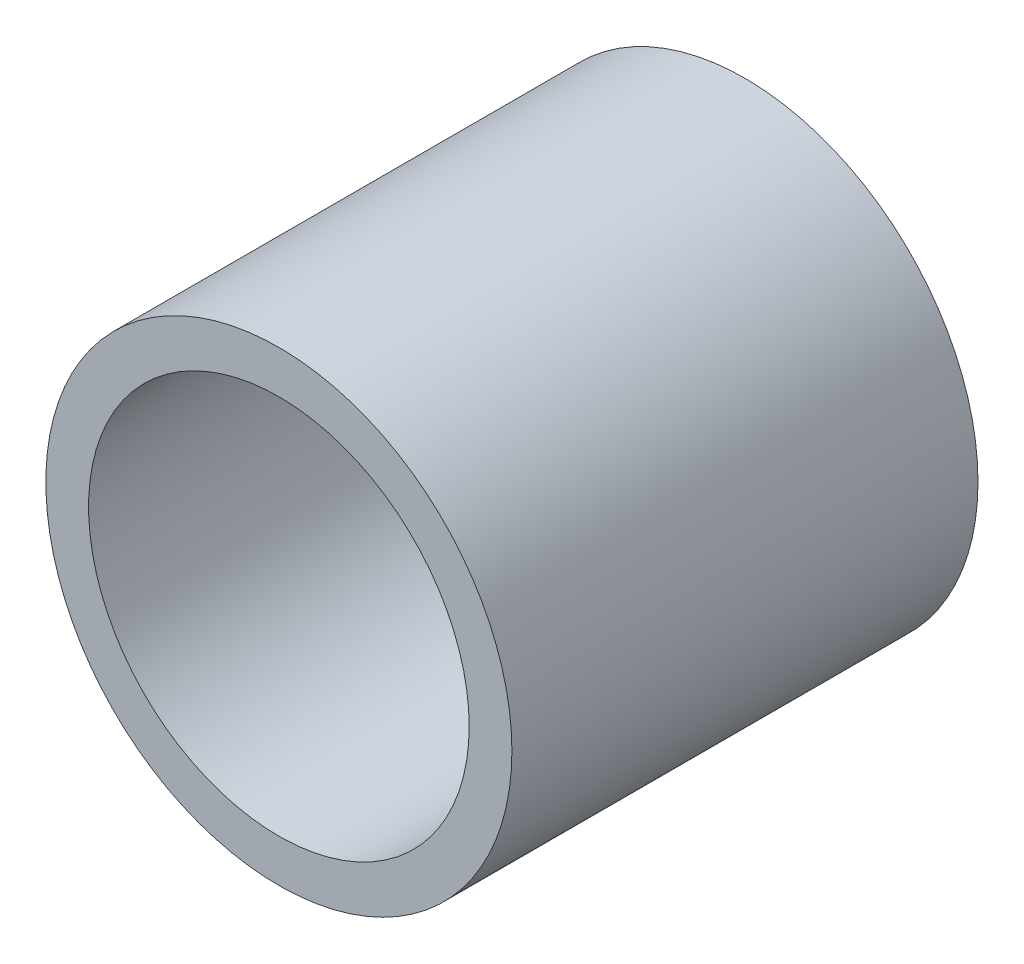
ISO-10303-21;
HEADER;
FILE_DESCRIPTION(('STEP AP214'),'2;1');
FILE_NAME('part.step','',(''),(''),'','','');
FILE_SCHEMA(('AUTOMOTIVE_DESIGN { 1 0 10303 214 1 1 1 1 }'));
ENDSEC;
DATA;
#1=APPLICATION_CONTEXT('core data for automotive mechanical design processes');
#2=APPLICATION_PROTOCOL_DEFINITION('international standard','automotive_design',2000,#1);
#3=PRODUCT_CONTEXT('',#1,'mechanical');
#4=PRODUCT('Part','Part','',(#3));
#5=PRODUCT_RELATED_PRODUCT_CATEGORY('part','',(#4));
#6=PRODUCT_DEFINITION_FORMATION('','',#4);
#7=PRODUCT_DEFINITION_CONTEXT('part definition',#1,'design');
#8=PRODUCT_DEFINITION('design','',#6,#7);
#9=PRODUCT_DEFINITION_SHAPE('','',#8);
#10=(LENGTH_UNIT() NAMED_UNIT(*) SI_UNIT(.MILLI.,.METRE.));
#11=(NAMED_UNIT(*) PLANE_ANGLE_UNIT() SI_UNIT($,.RADIAN.));
#12=(NAMED_UNIT(*) SI_UNIT($,.STERADIAN.) SOLID_ANGLE_UNIT());
#13=UNCERTAINTY_MEASURE_WITH_UNIT(LENGTH_MEASURE(1.E-05),#10,'distance_accuracy_value','');
#14=(GEOMETRIC_REPRESENTATION_CONTEXT(3) GLOBAL_UNCERTAINTY_ASSIGNED_CONTEXT((#13)) GLOBAL_UNIT_ASSIGNED_CONTEXT((#10,
#11,#12)) REPRESENTATION_CONTEXT('',''));
#15=CARTESIAN_POINT('',(0.,0.,0.));
#16=DIRECTION('',(0.,0.,1.));
#17=DIRECTION('',(1.,0.,0.));
#18=AXIS2_PLACEMENT_3D('',#15,#16,#17);
#19=CARTESIAN_POINT('',(0.,0.,120.));
#20=DIRECTION('',(0.,0.,-1.));
#21=DIRECTION('',(-1.,0.,0.));
#22=AXIS2_PLACEMENT_3D('',#19,#20,#21);
#23=CYLINDRICAL_SURFACE('',#22,60.);
#24=CARTESIAN_POINT('',(0.,0.,120.));
#25=DIRECTION('',(0.,0.,1.));
#26=DIRECTION('',(1.,0.,0.));
#27=AXIS2_PLACEMENT_3D('',#24,#25,#26);
#28=CIRCLE('',#27,60.);
#29=CARTESIAN_POINT('',(60.,0.,120.));
#30=VERTEX_POINT('',#29);
#31=EDGE_CURVE('E10',#30,#30,#28,.T.);
#32=ORIENTED_EDGE('',*,*,#31,.F.);
#33=EDGE_LOOP('',(#32));
#34=FACE_BOUND('',#33,.T.);
#35=CARTESIAN_POINT('',(0.,0.,0.));
#36=DIRECTION('',(0.,0.,1.));
#37=DIRECTION('',(1.,0.,0.));
#38=AXIS2_PLACEMENT_3D('',#35,#36,#37);
#39=CIRCLE('',#38,60.);
#40=CARTESIAN_POINT('',(60.,0.,0.));
#41=VERTEX_POINT('',#40);
#42=EDGE_CURVE('E45',#41,#41,#39,.T.);
#43=ORIENTED_EDGE('',*,*,#42,.T.);
#44=EDGE_LOOP('',(#43));
#45=FACE_BOUND('',#44,.T.);
#46=ADVANCED_FACE('F37',(#34,#45),#23,.T.);
#47=CARTESIAN_POINT('',(0.,0.,120.));
#48=DIRECTION('',(0.,0.,1.));
#49=DIRECTION('',(1.,0.,0.));
#50=AXIS2_PLACEMENT_3D('',#47,#48,#49);
#51=PLANE('',#50);
#52=CARTESIAN_POINT('',(0.,0.,120.));
#53=DIRECTION('',(0.,0.,1.));
#54=DIRECTION('',(1.,0.,0.));
#55=AXIS2_PLACEMENT_3D('',#52,#53,#54);
#56=CIRCLE('',#55,49.);
#57=CARTESIAN_POINT('',(49.,0.,120.));
#58=VERTEX_POINT('',#57);
#59=EDGE_CURVE('E52',#58,#58,#56,.T.);
#60=ORIENTED_EDGE('',*,*,#59,.F.);
#61=EDGE_LOOP('',(#60));
#62=FACE_BOUND('',#61,.T.);
#63=ORIENTED_EDGE('',*,*,#31,.T.);
#64=EDGE_LOOP('',(#63));
#65=FACE_BOUND('',#64,.T.);
#66=ADVANCED_FACE('F70',(#62,#65),#51,.T.);
#67=CARTESIAN_POINT('',(0.,0.,0.));
#68=DIRECTION('',(0.,0.,1.));
#69=DIRECTION('',(1.,0.,0.));
#70=AXIS2_PLACEMENT_3D('',#67,#68,#69);
#71=PLANE('',#70);
#72=CARTESIAN_POINT('',(0.,0.,0.));
#73=DIRECTION('',(0.,0.,1.));
#74=DIRECTION('',(1.,0.,0.));
#75=AXIS2_PLACEMENT_3D('',#72,#73,#74);
#76=CIRCLE('',#75,49.);
#77=CARTESIAN_POINT('',(49.,0.,0.));
#78=VERTEX_POINT('',#77);
#79=EDGE_CURVE('E40',#78,#78,#76,.T.);
#80=ORIENTED_EDGE('',*,*,#79,.T.);
#81=EDGE_LOOP('',(#80));
#82=FACE_BOUND('',#81,.T.);
#83=ORIENTED_EDGE('',*,*,#42,.F.);
#84=EDGE_LOOP('',(#83));
#85=FACE_BOUND('',#84,.T.);
#86=ADVANCED_FACE('F61',(#82,#85),#71,.F.);
#87=CARTESIAN_POINT('',(0.,0.,-10.));
#88=DIRECTION('',(0.,0.,1.));
#89=DIRECTION('',(1.,0.,0.));
#90=AXIS2_PLACEMENT_3D('',#87,#88,#89);
#91=CYLINDRICAL_SURFACE('',#90,49.);
#92=ORIENTED_EDGE('',*,*,#59,.T.);
#93=EDGE_LOOP('',(#92));
#94=FACE_BOUND('',#93,.T.);
#95=ORIENTED_EDGE('',*,*,#79,.F.);
#96=EDGE_LOOP('',(#95));
#97=FACE_BOUND('',#96,.T.);
#98=ADVANCED_FACE('F64',(#94,#97),#91,.F.);
#99=CLOSED_SHELL('',(#46,#66,#86,#98));
#100=MANIFOLD_SOLID_BREP('B2',#99);
#101=ADVANCED_BREP_SHAPE_REPRESENTATION('',(#18,#100),#14);
#102=SHAPE_DEFINITION_REPRESENTATION(#9,#101);
ENDSEC;
END-ISO-10303-21;
